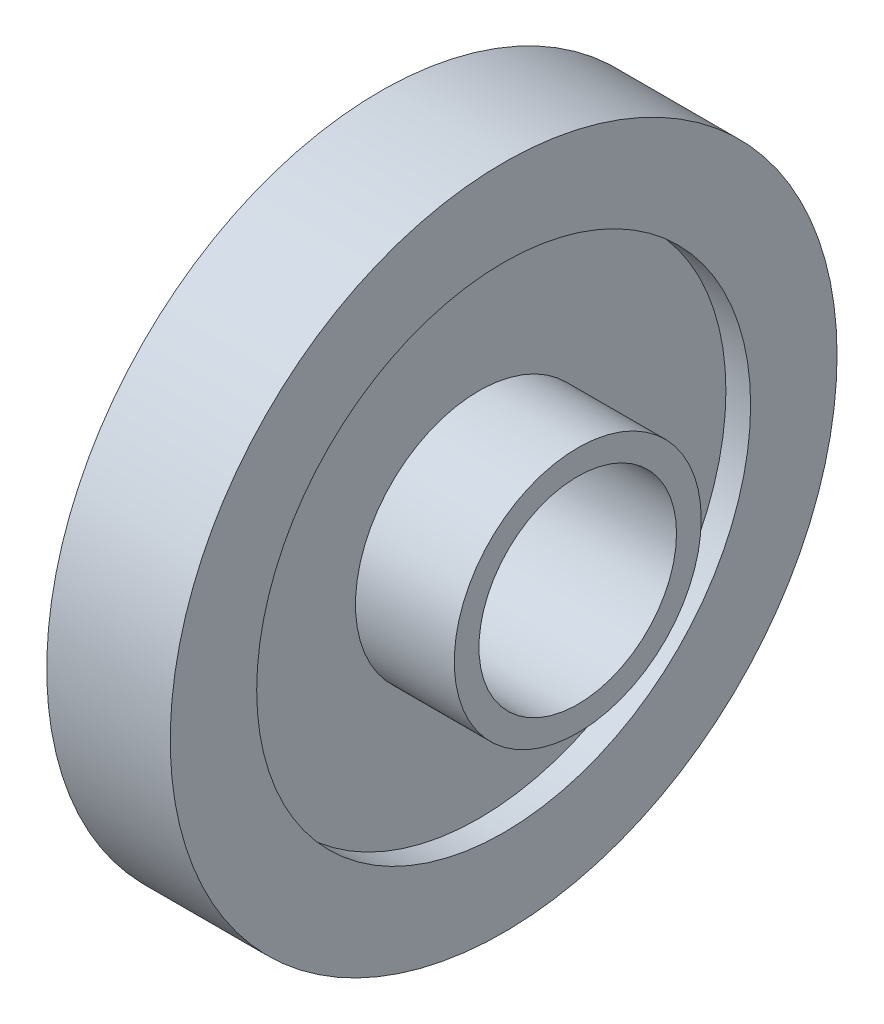
ISO-10303-21;
HEADER;
FILE_DESCRIPTION(('STEP AP214'),'2;1');
FILE_NAME('part.step','',(''),(''),'','','');
FILE_SCHEMA(('AUTOMOTIVE_DESIGN { 1 0 10303 214 1 1 1 1 }'));
ENDSEC;
DATA;
#1=APPLICATION_CONTEXT('core data for automotive mechanical design processes');
#2=APPLICATION_PROTOCOL_DEFINITION('international standard','automotive_design',2000,#1);
#3=PRODUCT_CONTEXT('',#1,'mechanical');
#4=PRODUCT('Part','Part','',(#3));
#5=PRODUCT_RELATED_PRODUCT_CATEGORY('part','',(#4));
#6=PRODUCT_DEFINITION_FORMATION('','',#4);
#7=PRODUCT_DEFINITION_CONTEXT('part definition',#1,'design');
#8=PRODUCT_DEFINITION('design','',#6,#7);
#9=PRODUCT_DEFINITION_SHAPE('','',#8);
#10=(LENGTH_UNIT() NAMED_UNIT(*) SI_UNIT(.MILLI.,.METRE.));
#11=(NAMED_UNIT(*) PLANE_ANGLE_UNIT() SI_UNIT($,.RADIAN.));
#12=(NAMED_UNIT(*) SI_UNIT($,.STERADIAN.) SOLID_ANGLE_UNIT());
#13=UNCERTAINTY_MEASURE_WITH_UNIT(LENGTH_MEASURE(1.E-05),#10,'distance_accuracy_value','');
#14=(GEOMETRIC_REPRESENTATION_CONTEXT(3) GLOBAL_UNCERTAINTY_ASSIGNED_CONTEXT((#13)) GLOBAL_UNIT_ASSIGNED_CONTEXT((#10,
#11,#12)) REPRESENTATION_CONTEXT('',''));
#15=CARTESIAN_POINT('',(0.,0.,0.));
#16=DIRECTION('',(0.,0.,1.));
#17=DIRECTION('',(1.,0.,0.));
#18=AXIS2_PLACEMENT_3D('',#15,#16,#17);
#19=CARTESIAN_POINT('',(4.,0.,0.));
#20=DIRECTION('',(1.,0.,0.));
#21=DIRECTION('',(0.,0.,-1.));
#22=AXIS2_PLACEMENT_3D('',#19,#20,#21);
#23=PLANE('',#22);
#24=CARTESIAN_POINT('',(4.,0.,0.));
#25=DIRECTION('',(1.,0.,0.));
#26=DIRECTION('',(0.,0.,-1.));
#27=AXIS2_PLACEMENT_3D('',#24,#25,#26);
#28=CIRCLE('',#27,10.);
#29=CARTESIAN_POINT('',(4.,0.,-10.));
#30=VERTEX_POINT('',#29);
#31=EDGE_CURVE('E46',#30,#30,#28,.T.);
#32=ORIENTED_EDGE('',*,*,#31,.T.);
#33=EDGE_LOOP('',(#32));
#34=FACE_BOUND('',#33,.T.);
#35=CARTESIAN_POINT('',(4.,0.,0.));
#36=DIRECTION('',(1.,0.,0.));
#37=DIRECTION('',(0.,0.,-1.));
#38=AXIS2_PLACEMENT_3D('',#35,#36,#37);
#39=CIRCLE('',#38,5.);
#40=CARTESIAN_POINT('',(4.,0.,-5.));
#41=VERTEX_POINT('',#40);
#42=EDGE_CURVE('E60',#41,#41,#39,.T.);
#43=ORIENTED_EDGE('',*,*,#42,.F.);
#44=EDGE_LOOP('',(#43));
#45=FACE_BOUND('',#44,.T.);
#46=ADVANCED_FACE('F35',(#34,#45),#23,.T.);
#47=CARTESIAN_POINT('',(5.,0.,0.));
#48=DIRECTION('',(-1.,0.,0.));
#49=DIRECTION('',(0.,0.,1.));
#50=AXIS2_PLACEMENT_3D('',#47,#48,#49);
#51=CYLINDRICAL_SURFACE('',#50,13.5);
#52=CARTESIAN_POINT('',(5.,0.,0.));
#53=DIRECTION('',(1.,0.,0.));
#54=DIRECTION('',(0.,0.,-1.));
#55=AXIS2_PLACEMENT_3D('',#52,#53,#54);
#56=CIRCLE('',#55,13.5);
#57=CARTESIAN_POINT('',(5.,0.,-13.5));
#58=VERTEX_POINT('',#57);
#59=EDGE_CURVE('E10',#58,#58,#56,.T.);
#60=ORIENTED_EDGE('',*,*,#59,.F.);
#61=EDGE_LOOP('',(#60));
#62=FACE_BOUND('',#61,.T.);
#63=CARTESIAN_POINT('',(0.,0.,0.));
#64=DIRECTION('',(1.,0.,0.));
#65=DIRECTION('',(0.,0.,-1.));
#66=AXIS2_PLACEMENT_3D('',#63,#64,#65);
#67=CIRCLE('',#66,13.5);
#68=CARTESIAN_POINT('',(0.,0.,-13.5));
#69=VERTEX_POINT('',#68);
#70=EDGE_CURVE('E39',#69,#69,#67,.T.);
#71=ORIENTED_EDGE('',*,*,#70,.T.);
#72=EDGE_LOOP('',(#71));
#73=FACE_BOUND('',#72,.T.);
#74=ADVANCED_FACE('F37',(#62,#73),#51,.T.);
#75=CARTESIAN_POINT('',(5.,0.,0.));
#76=DIRECTION('',(1.,0.,0.));
#77=DIRECTION('',(0.,0.,-1.));
#78=AXIS2_PLACEMENT_3D('',#75,#76,#77);
#79=PLANE('',#78);
#80=CARTESIAN_POINT('',(5.,0.,0.));
#81=DIRECTION('',(1.,0.,0.));
#82=DIRECTION('',(0.,0.,-1.));
#83=AXIS2_PLACEMENT_3D('',#80,#81,#82);
#84=CIRCLE('',#83,10.);
#85=CARTESIAN_POINT('',(5.,0.,-10.));
#86=VERTEX_POINT('',#85);
#87=EDGE_CURVE('E48',#86,#86,#84,.T.);
#88=ORIENTED_EDGE('',*,*,#87,.F.);
#89=EDGE_LOOP('',(#88));
#90=FACE_BOUND('',#89,.T.);
#91=ORIENTED_EDGE('',*,*,#59,.T.);
#92=EDGE_LOOP('',(#91));
#93=FACE_BOUND('',#92,.T.);
#94=ADVANCED_FACE('F93',(#90,#93),#79,.T.);
#95=CARTESIAN_POINT('',(0.,0.,0.));
#96=DIRECTION('',(1.,0.,0.));
#97=DIRECTION('',(0.,0.,-1.));
#98=AXIS2_PLACEMENT_3D('',#95,#96,#97);
#99=PLANE('',#98);
#100=CARTESIAN_POINT('',(0.,0.,0.));
#101=DIRECTION('',(-1.,0.,0.));
#102=DIRECTION('',(0.,0.,1.));
#103=AXIS2_PLACEMENT_3D('',#100,#101,#102);
#104=CIRCLE('',#103,10.);
#105=CARTESIAN_POINT('',(0.,0.,10.));
#106=VERTEX_POINT('',#105);
#107=EDGE_CURVE('E54',#106,#106,#104,.T.);
#108=ORIENTED_EDGE('',*,*,#107,.F.);
#109=EDGE_LOOP('',(#108));
#110=FACE_BOUND('',#109,.T.);
#111=ORIENTED_EDGE('',*,*,#70,.F.);
#112=EDGE_LOOP('',(#111));
#113=FACE_BOUND('',#112,.T.);
#114=ADVANCED_FACE('F102',(#110,#113),#99,.F.);
#115=CARTESIAN_POINT('',(4.,0.,0.));
#116=DIRECTION('',(1.,0.,0.));
#117=DIRECTION('',(0.,0.,-1.));
#118=AXIS2_PLACEMENT_3D('',#115,#116,#117);
#119=CYLINDRICAL_SURFACE('',#118,10.);
#120=ORIENTED_EDGE('',*,*,#31,.F.);
#121=EDGE_LOOP('',(#120));
#122=FACE_BOUND('',#121,.T.);
#123=ORIENTED_EDGE('',*,*,#87,.T.);
#124=EDGE_LOOP('',(#123));
#125=FACE_BOUND('',#124,.T.);
#126=ADVANCED_FACE('F99',(#122,#125),#119,.F.);
#127=CARTESIAN_POINT('',(1.,0.,0.));
#128=DIRECTION('',(-1.,0.,0.));
#129=DIRECTION('',(0.,0.,1.));
#130=AXIS2_PLACEMENT_3D('',#127,#128,#129);
#131=CYLINDRICAL_SURFACE('',#130,10.);
#132=CARTESIAN_POINT('',(1.,0.,0.));
#133=DIRECTION('',(-1.,0.,0.));
#134=DIRECTION('',(0.,0.,1.));
#135=AXIS2_PLACEMENT_3D('',#132,#133,#134);
#136=CIRCLE('',#135,10.);
#137=CARTESIAN_POINT('',(1.,0.,10.));
#138=VERTEX_POINT('',#137);
#139=EDGE_CURVE('E51',#138,#138,#136,.T.);
#140=ORIENTED_EDGE('',*,*,#139,.F.);
#141=EDGE_LOOP('',(#140));
#142=FACE_BOUND('',#141,.T.);
#143=ORIENTED_EDGE('',*,*,#107,.T.);
#144=EDGE_LOOP('',(#143));
#145=FACE_BOUND('',#144,.T.);
#146=ADVANCED_FACE('F97',(#142,#145),#131,.F.);
#147=CARTESIAN_POINT('',(1.,0.,0.));
#148=DIRECTION('',(-1.,0.,0.));
#149=DIRECTION('',(0.,0.,1.));
#150=AXIS2_PLACEMENT_3D('',#147,#148,#149);
#151=PLANE('',#150);
#152=CARTESIAN_POINT('',(1.,0.,0.));
#153=DIRECTION('',(-1.,0.,0.));
#154=DIRECTION('',(0.,0.,1.));
#155=AXIS2_PLACEMENT_3D('',#152,#153,#154);
#156=CIRCLE('',#155,4.);
#157=CARTESIAN_POINT('',(1.,0.,4.));
#158=VERTEX_POINT('',#157);
#159=EDGE_CURVE('E63',#158,#158,#156,.T.);
#160=ORIENTED_EDGE('',*,*,#159,.F.);
#161=EDGE_LOOP('',(#160));
#162=FACE_BOUND('',#161,.T.);
#163=ORIENTED_EDGE('',*,*,#139,.T.);
#164=EDGE_LOOP('',(#163));
#165=FACE_BOUND('',#164,.T.);
#166=ADVANCED_FACE('F83',(#162,#165),#151,.T.);
#167=CARTESIAN_POINT('',(8.,0.,0.));
#168=DIRECTION('',(-1.,0.,0.));
#169=DIRECTION('',(0.,0.,1.));
#170=AXIS2_PLACEMENT_3D('',#167,#168,#169);
#171=CYLINDRICAL_SURFACE('',#170,5.);
#172=CARTESIAN_POINT('',(8.,0.,0.));
#173=DIRECTION('',(1.,0.,0.));
#174=DIRECTION('',(0.,0.,-1.));
#175=AXIS2_PLACEMENT_3D('',#172,#173,#174);
#176=CIRCLE('',#175,5.);
#177=CARTESIAN_POINT('',(8.,0.,-5.));
#178=VERTEX_POINT('',#177);
#179=EDGE_CURVE('E57',#178,#178,#176,.T.);
#180=ORIENTED_EDGE('',*,*,#179,.F.);
#181=EDGE_LOOP('',(#180));
#182=FACE_BOUND('',#181,.T.);
#183=ORIENTED_EDGE('',*,*,#42,.T.);
#184=EDGE_LOOP('',(#183));
#185=FACE_BOUND('',#184,.T.);
#186=ADVANCED_FACE('F77',(#182,#185),#171,.T.);
#187=CARTESIAN_POINT('',(8.,0.,0.));
#188=DIRECTION('',(1.,0.,0.));
#189=DIRECTION('',(0.,0.,-1.));
#190=AXIS2_PLACEMENT_3D('',#187,#188,#189);
#191=PLANE('',#190);
#192=CARTESIAN_POINT('',(8.,0.,0.));
#193=DIRECTION('',(1.,0.,0.));
#194=DIRECTION('',(0.,0.,-1.));
#195=AXIS2_PLACEMENT_3D('',#192,#193,#194);
#196=CIRCLE('',#195,4.);
#197=CARTESIAN_POINT('',(8.,0.,-4.));
#198=VERTEX_POINT('',#197);
#199=EDGE_CURVE('E68',#198,#198,#196,.T.);
#200=ORIENTED_EDGE('',*,*,#199,.F.);
#201=EDGE_LOOP('',(#200));
#202=FACE_BOUND('',#201,.T.);
#203=ORIENTED_EDGE('',*,*,#179,.T.);
#204=EDGE_LOOP('',(#203));
#205=FACE_BOUND('',#204,.T.);
#206=ADVANCED_FACE('F74',(#202,#205),#191,.T.);
#207=CARTESIAN_POINT('',(0.,0.,0.));
#208=DIRECTION('',(1.,0.,0.));
#209=DIRECTION('',(0.,0.,-1.));
#210=AXIS2_PLACEMENT_3D('',#207,#208,#209);
#211=CYLINDRICAL_SURFACE('',#210,4.);
#212=ORIENTED_EDGE('',*,*,#159,.T.);
#213=EDGE_LOOP('',(#212));
#214=FACE_BOUND('',#213,.T.);
#215=ORIENTED_EDGE('',*,*,#199,.T.);
#216=EDGE_LOOP('',(#215));
#217=FACE_BOUND('',#216,.T.);
#218=ADVANCED_FACE('F72',(#214,#217),#211,.F.);
#219=CLOSED_SHELL('',(#46,#74,#94,#114,#126,#146,#166,#186,#206,#218));
#220=MANIFOLD_SOLID_BREP('B2',#219);
#221=ADVANCED_BREP_SHAPE_REPRESENTATION('',(#18,#220),#14);
#222=SHAPE_DEFINITION_REPRESENTATION(#9,#221);
ENDSEC;
END-ISO-10303-21;
